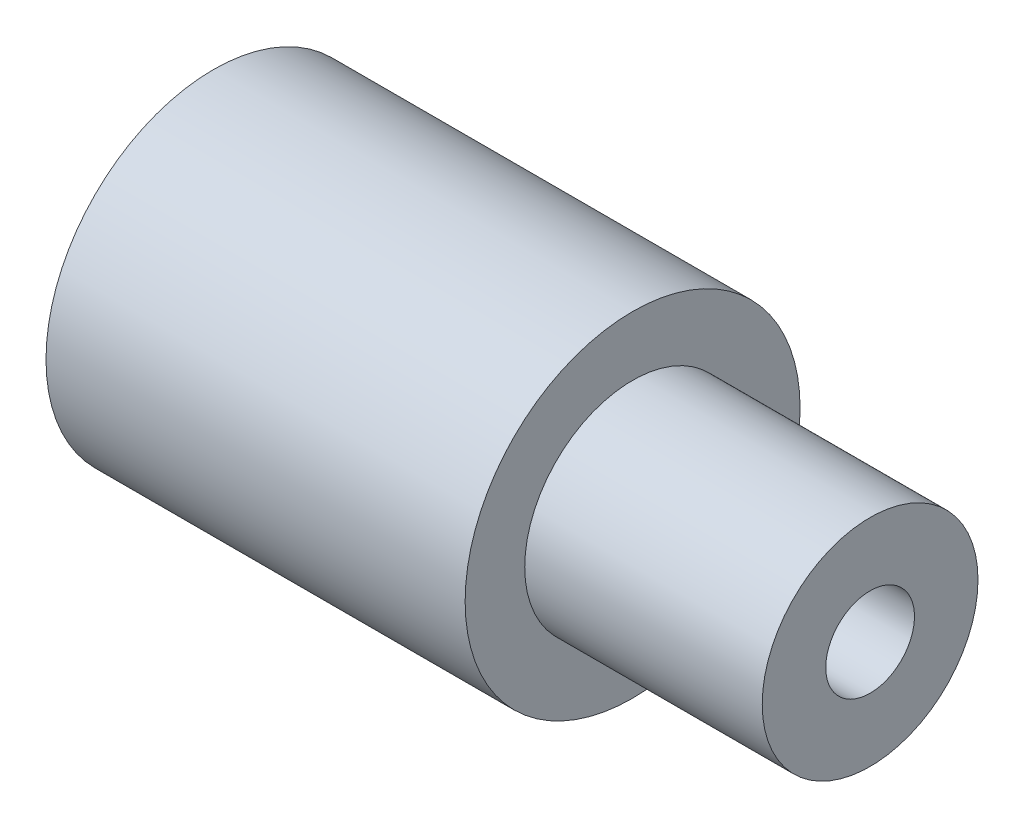
ISO-10303-21;
HEADER;
FILE_DESCRIPTION(('STEP AP214'),'2;1');
FILE_NAME('part.step','',(''),(''),'','','');
FILE_SCHEMA(('AUTOMOTIVE_DESIGN { 1 0 10303 214 1 1 1 1 }'));
ENDSEC;
DATA;
#1=APPLICATION_CONTEXT('core data for automotive mechanical design processes');
#2=APPLICATION_PROTOCOL_DEFINITION('international standard','automotive_design',2000,#1);
#3=PRODUCT_CONTEXT('',#1,'mechanical');
#4=PRODUCT('Part','Part','',(#3));
#5=PRODUCT_RELATED_PRODUCT_CATEGORY('part','',(#4));
#6=PRODUCT_DEFINITION_FORMATION('','',#4);
#7=PRODUCT_DEFINITION_CONTEXT('part definition',#1,'design');
#8=PRODUCT_DEFINITION('design','',#6,#7);
#9=PRODUCT_DEFINITION_SHAPE('','',#8);
#10=(LENGTH_UNIT() NAMED_UNIT(*) SI_UNIT(.MILLI.,.METRE.));
#11=(NAMED_UNIT(*) PLANE_ANGLE_UNIT() SI_UNIT($,.RADIAN.));
#12=(NAMED_UNIT(*) SI_UNIT($,.STERADIAN.) SOLID_ANGLE_UNIT());
#13=UNCERTAINTY_MEASURE_WITH_UNIT(LENGTH_MEASURE(1.E-05),#10,'distance_accuracy_value','');
#14=(GEOMETRIC_REPRESENTATION_CONTEXT(3) GLOBAL_UNCERTAINTY_ASSIGNED_CONTEXT((#13)) GLOBAL_UNIT_ASSIGNED_CONTEXT((#10,
#11,#12)) REPRESENTATION_CONTEXT('',''));
#15=CARTESIAN_POINT('',(0.,0.,0.));
#16=DIRECTION('',(0.,0.,1.));
#17=DIRECTION('',(1.,0.,0.));
#18=AXIS2_PLACEMENT_3D('',#15,#16,#17);
#19=CARTESIAN_POINT('',(-23.5,0.,0.));
#20=DIRECTION('',(1.,0.,0.));
#21=DIRECTION('',(0.,0.,-1.));
#22=AXIS2_PLACEMENT_3D('',#19,#20,#21);
#23=PLANE('',#22);
#24=CARTESIAN_POINT('',(-23.5,0.,0.));
#25=DIRECTION('',(1.,0.,0.));
#26=DIRECTION('',(0.,0.,-1.));
#27=AXIS2_PLACEMENT_3D('',#24,#25,#26);
#28=CIRCLE('',#27,6.35);
#29=CARTESIAN_POINT('',(-23.5,0.,-6.35));
#30=VERTEX_POINT('',#29);
#31=EDGE_CURVE('E55',#30,#30,#28,.F.);
#32=ORIENTED_EDGE('',*,*,#31,.F.);
#33=EDGE_LOOP('',(#32));
#34=FACE_BOUND('',#33,.T.);
#35=CARTESIAN_POINT('',(-23.5,0.,0.));
#36=DIRECTION('',(-1.,0.,0.));
#37=DIRECTION('',(0.,0.,1.));
#38=AXIS2_PLACEMENT_3D('',#35,#36,#37);
#39=CIRCLE('',#38,11.988);
#40=CARTESIAN_POINT('',(-23.5,0.,11.988));
#41=VERTEX_POINT('',#40);
#42=EDGE_CURVE('E10',#41,#41,#39,.T.);
#43=ORIENTED_EDGE('',*,*,#42,.T.);
#44=EDGE_LOOP('',(#43));
#45=FACE_BOUND('',#44,.T.);
#46=ADVANCED_FACE('F40',(#34,#45),#23,.F.);
#47=CARTESIAN_POINT('',(-1000.,0.,0.));
#48=DIRECTION('',(-1.,0.,0.));
#49=DIRECTION('',(0.,0.,1.));
#50=AXIS2_PLACEMENT_3D('',#47,#48,#49);
#51=CYLINDRICAL_SURFACE('',#50,11.988);
#52=ORIENTED_EDGE('',*,*,#42,.F.);
#53=EDGE_LOOP('',(#52));
#54=FACE_BOUND('',#53,.T.);
#55=CARTESIAN_POINT('',(6.49999999999995,0.,0.));
#56=DIRECTION('',(-1.,0.,0.));
#57=DIRECTION('',(0.,0.,1.));
#58=AXIS2_PLACEMENT_3D('',#55,#56,#57);
#59=CIRCLE('',#58,11.988);
#60=CARTESIAN_POINT('',(6.49999999999995,0.,11.988));
#61=VERTEX_POINT('',#60);
#62=EDGE_CURVE('E42',#61,#61,#59,.T.);
#63=ORIENTED_EDGE('',*,*,#62,.T.);
#64=EDGE_LOOP('',(#63));
#65=FACE_BOUND('',#64,.T.);
#66=ADVANCED_FACE('F91',(#54,#65),#51,.T.);
#67=CARTESIAN_POINT('',(6.5,11.988,0.));
#68=DIRECTION('',(-1.,0.,0.));
#69=DIRECTION('',(0.,0.,1.));
#70=AXIS2_PLACEMENT_3D('',#67,#68,#69);
#71=PLANE('',#70);
#72=ORIENTED_EDGE('',*,*,#62,.F.);
#73=EDGE_LOOP('',(#72));
#74=FACE_BOUND('',#73,.T.);
#75=CARTESIAN_POINT('',(6.49999999999995,0.,0.));
#76=DIRECTION('',(-1.,0.,0.));
#77=DIRECTION('',(0.,0.,1.));
#78=AXIS2_PLACEMENT_3D('',#75,#76,#77);
#79=CIRCLE('',#78,7.722);
#80=CARTESIAN_POINT('',(6.49999999999995,0.,7.722));
#81=VERTEX_POINT('',#80);
#82=EDGE_CURVE('E47',#81,#81,#79,.T.);
#83=ORIENTED_EDGE('',*,*,#82,.T.);
#84=EDGE_LOOP('',(#83));
#85=FACE_BOUND('',#84,.T.);
#86=ADVANCED_FACE('F66',(#74,#85),#71,.F.);
#87=CARTESIAN_POINT('',(-1000.,0.,0.));
#88=DIRECTION('',(-1.,0.,0.));
#89=DIRECTION('',(0.,0.,1.));
#90=AXIS2_PLACEMENT_3D('',#87,#88,#89);
#91=CYLINDRICAL_SURFACE('',#90,7.722);
#92=ORIENTED_EDGE('',*,*,#82,.F.);
#93=EDGE_LOOP('',(#92));
#94=FACE_BOUND('',#93,.T.);
#95=CARTESIAN_POINT('',(23.5000000000001,0.,0.));
#96=DIRECTION('',(-1.,0.,0.));
#97=DIRECTION('',(0.,0.,1.));
#98=AXIS2_PLACEMENT_3D('',#95,#96,#97);
#99=CIRCLE('',#98,7.722);
#100=CARTESIAN_POINT('',(23.5000000000001,0.,7.722));
#101=VERTEX_POINT('',#100);
#102=EDGE_CURVE('E53',#101,#101,#99,.T.);
#103=ORIENTED_EDGE('',*,*,#102,.T.);
#104=EDGE_LOOP('',(#103));
#105=FACE_BOUND('',#104,.T.);
#106=ADVANCED_FACE('F75',(#94,#105),#91,.T.);
#107=CARTESIAN_POINT('',(23.5,7.722,0.));
#108=DIRECTION('',(-1.,0.,0.));
#109=DIRECTION('',(0.,0.,1.));
#110=AXIS2_PLACEMENT_3D('',#107,#108,#109);
#111=PLANE('',#110);
#112=CARTESIAN_POINT('',(23.5000000000001,0.,0.));
#113=DIRECTION('',(-1.,0.,0.));
#114=DIRECTION('',(0.,0.,1.));
#115=AXIS2_PLACEMENT_3D('',#112,#113,#114);
#116=CIRCLE('',#115,3.175);
#117=CARTESIAN_POINT('',(23.5000000000001,0.,3.175));
#118=VERTEX_POINT('',#117);
#119=EDGE_CURVE('E37',#118,#118,#116,.F.);
#120=ORIENTED_EDGE('',*,*,#119,.F.);
#121=EDGE_LOOP('',(#120));
#122=FACE_BOUND('',#121,.T.);
#123=ORIENTED_EDGE('',*,*,#102,.F.);
#124=EDGE_LOOP('',(#123));
#125=FACE_BOUND('',#124,.T.);
#126=ADVANCED_FACE('F73',(#122,#125),#111,.F.);
#127=CARTESIAN_POINT('',(-1000.,0.,0.));
#128=DIRECTION('',(-1.,0.,0.));
#129=DIRECTION('',(0.,0.,1.));
#130=AXIS2_PLACEMENT_3D('',#127,#128,#129);
#131=CYLINDRICAL_SURFACE('',#130,6.35);
#132=CARTESIAN_POINT('',(-0.600000000000045,0.,0.));
#133=DIRECTION('',(-1.,0.,0.));
#134=DIRECTION('',(0.,0.,1.));
#135=AXIS2_PLACEMENT_3D('',#132,#133,#134);
#136=CIRCLE('',#135,6.35);
#137=CARTESIAN_POINT('',(-0.600000000000045,0.,6.35));
#138=VERTEX_POINT('',#137);
#139=EDGE_CURVE('E54',#138,#138,#136,.T.);
#140=ORIENTED_EDGE('',*,*,#139,.F.);
#141=EDGE_LOOP('',(#140));
#142=FACE_BOUND('',#141,.T.);
#143=ORIENTED_EDGE('',*,*,#31,.T.);
#144=EDGE_LOOP('',(#143));
#145=FACE_BOUND('',#144,.T.);
#146=ADVANCED_FACE('F76',(#142,#145),#131,.F.);
#147=CARTESIAN_POINT('',(-0.600000000000001,6.35,0.));
#148=DIRECTION('',(-1.,0.,0.));
#149=DIRECTION('',(0.,0.,1.));
#150=AXIS2_PLACEMENT_3D('',#147,#148,#149);
#151=PLANE('',#150);
#152=ORIENTED_EDGE('',*,*,#139,.T.);
#153=EDGE_LOOP('',(#152));
#154=FACE_BOUND('',#153,.T.);
#155=ADVANCED_FACE('F86',(#154),#151,.T.);
#156=CARTESIAN_POINT('',(-1000.,0.,0.));
#157=DIRECTION('',(-1.,0.,0.));
#158=DIRECTION('',(0.,0.,1.));
#159=AXIS2_PLACEMENT_3D('',#156,#157,#158);
#160=CYLINDRICAL_SURFACE('',#159,3.175);
#161=CARTESIAN_POINT('',(8.29999999999997,0.,0.));
#162=DIRECTION('',(-1.,0.,0.));
#163=DIRECTION('',(0.,0.,1.));
#164=AXIS2_PLACEMENT_3D('',#161,#162,#163);
#165=CIRCLE('',#164,3.175);
#166=CARTESIAN_POINT('',(8.29999999999997,0.,3.175));
#167=VERTEX_POINT('',#166);
#168=EDGE_CURVE('E61',#167,#167,#165,.T.);
#169=ORIENTED_EDGE('',*,*,#168,.T.);
#170=EDGE_LOOP('',(#169));
#171=FACE_BOUND('',#170,.T.);
#172=ORIENTED_EDGE('',*,*,#119,.T.);
#173=EDGE_LOOP('',(#172));
#174=FACE_BOUND('',#173,.T.);
#175=ADVANCED_FACE('F134',(#171,#174),#160,.F.);
#176=CARTESIAN_POINT('',(8.3,0.,0.));
#177=DIRECTION('',(1.,0.,0.));
#178=DIRECTION('',(0.,0.,-1.));
#179=AXIS2_PLACEMENT_3D('',#176,#177,#178);
#180=PLANE('',#179);
#181=ORIENTED_EDGE('',*,*,#168,.F.);
#182=EDGE_LOOP('',(#181));
#183=FACE_BOUND('',#182,.T.);
#184=ADVANCED_FACE('F136',(#183),#180,.T.);
#185=CLOSED_SHELL('',(#46,#66,#86,#106,#126,#146,#155,#175,#184));
#186=MANIFOLD_SOLID_BREP('B2',#185);
#187=ADVANCED_BREP_SHAPE_REPRESENTATION('',(#18,#186),#14);
#188=SHAPE_DEFINITION_REPRESENTATION(#9,#187);
ENDSEC;
END-ISO-10303-21;
